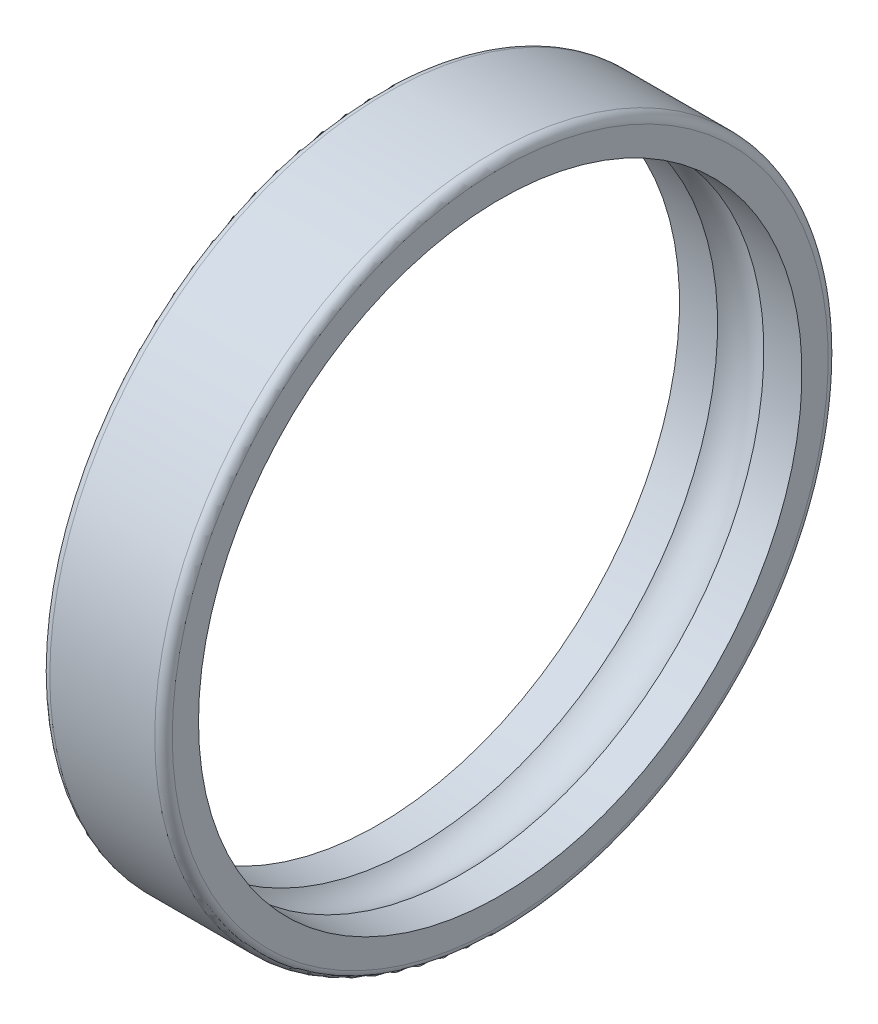
ISO-10303-21;
HEADER;
FILE_DESCRIPTION(('STEP AP214'),'2;1');
FILE_NAME('part.step','',(''),(''),'','','');
FILE_SCHEMA(('AUTOMOTIVE_DESIGN { 1 0 10303 214 1 1 1 1 }'));
ENDSEC;
DATA;
#1=APPLICATION_CONTEXT('core data for automotive mechanical design processes');
#2=APPLICATION_PROTOCOL_DEFINITION('international standard','automotive_design',2000,#1);
#3=PRODUCT_CONTEXT('',#1,'mechanical');
#4=PRODUCT('Part','Part','',(#3));
#5=PRODUCT_RELATED_PRODUCT_CATEGORY('part','',(#4));
#6=PRODUCT_DEFINITION_FORMATION('','',#4);
#7=PRODUCT_DEFINITION_CONTEXT('part definition',#1,'design');
#8=PRODUCT_DEFINITION('design','',#6,#7);
#9=PRODUCT_DEFINITION_SHAPE('','',#8);
#10=(LENGTH_UNIT() NAMED_UNIT(*) SI_UNIT(.MILLI.,.METRE.));
#11=(NAMED_UNIT(*) PLANE_ANGLE_UNIT() SI_UNIT($,.RADIAN.));
#12=(NAMED_UNIT(*) SI_UNIT($,.STERADIAN.) SOLID_ANGLE_UNIT());
#13=UNCERTAINTY_MEASURE_WITH_UNIT(LENGTH_MEASURE(1.E-05),#10,'distance_accuracy_value','');
#14=(GEOMETRIC_REPRESENTATION_CONTEXT(3) GLOBAL_UNCERTAINTY_ASSIGNED_CONTEXT((#13)) GLOBAL_UNIT_ASSIGNED_CONTEXT((#10,
#11,#12)) REPRESENTATION_CONTEXT('',''));
#15=CARTESIAN_POINT('',(0.,0.,0.));
#16=DIRECTION('',(0.,0.,1.));
#17=DIRECTION('',(1.,0.,0.));
#18=AXIS2_PLACEMENT_3D('',#15,#16,#17);
#19=CARTESIAN_POINT('',(0.,0.,0.));
#20=DIRECTION('',(-1.,0.,0.));
#21=DIRECTION('',(0.,0.,1.));
#22=AXIS2_PLACEMENT_3D('',#19,#20,#21);
#23=CYLINDRICAL_SURFACE('',#22,24.6428571428571);
#24=CARTESIAN_POINT('',(5.,0.,0.));
#25=DIRECTION('',(-1.,0.,0.));
#26=DIRECTION('',(0.,0.,1.));
#27=AXIS2_PLACEMENT_3D('',#24,#25,#26);
#28=CIRCLE('',#27,24.6428571428571);
#29=CARTESIAN_POINT('',(5.,0.,24.6428571428571));
#30=VERTEX_POINT('',#29);
#31=EDGE_CURVE('E376',#30,#30,#28,.T.);
#32=ORIENTED_EDGE('',*,*,#31,.F.);
#33=EDGE_LOOP('',(#32));
#34=FACE_BOUND('',#33,.T.);
#35=CARTESIAN_POINT('',(1.88982236504613,0.,0.));
#36=DIRECTION('',(-1.,0.,0.));
#37=DIRECTION('',(0.,0.,1.));
#38=AXIS2_PLACEMENT_3D('',#35,#36,#37);
#39=CIRCLE('',#38,24.6428571428571);
#40=CARTESIAN_POINT('',(1.88982236504613,0.,24.6428571428571));
#41=VERTEX_POINT('',#40);
#42=EDGE_CURVE('E10',#41,#41,#39,.T.);
#43=ORIENTED_EDGE('',*,*,#42,.T.);
#44=EDGE_LOOP('',(#43));
#45=FACE_BOUND('',#44,.T.);
#46=ADVANCED_FACE('F348',(#34,#45),#23,.F.);
#47=CARTESIAN_POINT('',(0.,0.,0.));
#48=DIRECTION('',(-1.,0.,0.));
#49=DIRECTION('',(0.,0.,1.));
#50=AXIS2_PLACEMENT_3D('',#47,#48,#49);
#51=TOROIDAL_SURFACE('',#50,22.5,2.85714285714286);
#52=ORIENTED_EDGE('',*,*,#42,.F.);
#53=EDGE_LOOP('',(#52));
#54=FACE_BOUND('',#53,.T.);
#55=CARTESIAN_POINT('',(-1.88982236504613,0.,0.));
#56=DIRECTION('',(-1.,0.,0.));
#57=DIRECTION('',(0.,0.,1.));
#58=AXIS2_PLACEMENT_3D('',#55,#56,#57);
#59=CIRCLE('',#58,24.6428571428571);
#60=CARTESIAN_POINT('',(-1.88982236504613,0.,24.6428571428571));
#61=VERTEX_POINT('',#60);
#62=EDGE_CURVE('E354',#61,#61,#59,.T.);
#63=ORIENTED_EDGE('',*,*,#62,.T.);
#64=EDGE_LOOP('',(#63));
#65=FACE_BOUND('',#64,.T.);
#66=ADVANCED_FACE('F383',(#54,#65),#51,.F.);
#67=CARTESIAN_POINT('',(0.,0.,0.));
#68=DIRECTION('',(-1.,0.,0.));
#69=DIRECTION('',(0.,0.,1.));
#70=AXIS2_PLACEMENT_3D('',#67,#68,#69);
#71=CYLINDRICAL_SURFACE('',#70,24.6428571428571);
#72=ORIENTED_EDGE('',*,*,#62,.F.);
#73=EDGE_LOOP('',(#72));
#74=FACE_BOUND('',#73,.T.);
#75=CARTESIAN_POINT('',(-5.,0.,0.));
#76=DIRECTION('',(-1.,0.,0.));
#77=DIRECTION('',(0.,0.,1.));
#78=AXIS2_PLACEMENT_3D('',#75,#76,#77);
#79=CIRCLE('',#78,24.6428571428571);
#80=CARTESIAN_POINT('',(-5.,0.,24.6428571428571));
#81=VERTEX_POINT('',#80);
#82=EDGE_CURVE('E358',#81,#81,#79,.T.);
#83=ORIENTED_EDGE('',*,*,#82,.T.);
#84=EDGE_LOOP('',(#83));
#85=FACE_BOUND('',#84,.T.);
#86=ADVANCED_FACE('F387',(#74,#85),#71,.F.);
#87=CARTESIAN_POINT('',(-5.,26.7857142857143,0.));
#88=DIRECTION('',(1.,0.,0.));
#89=DIRECTION('',(0.,0.,-1.));
#90=AXIS2_PLACEMENT_3D('',#87,#88,#89);
#91=PLANE('',#90);
#92=ORIENTED_EDGE('',*,*,#82,.F.);
#93=EDGE_LOOP('',(#92));
#94=FACE_BOUND('',#93,.T.);
#95=CARTESIAN_POINT('',(-5.,0.,0.));
#96=DIRECTION('',(-1.,0.,0.));
#97=DIRECTION('',(0.,0.,1.));
#98=AXIS2_PLACEMENT_3D('',#95,#96,#97);
#99=CIRCLE('',#98,26.7857142857143);
#100=CARTESIAN_POINT('',(-5.,0.,26.7857142857143));
#101=VERTEX_POINT('',#100);
#102=EDGE_CURVE('E362',#101,#101,#99,.T.);
#103=ORIENTED_EDGE('',*,*,#102,.T.);
#104=EDGE_LOOP('',(#103));
#105=FACE_BOUND('',#104,.T.);
#106=ADVANCED_FACE('F392',(#94,#105),#91,.F.);
#107=CARTESIAN_POINT('',(-4.28571428571429,0.,0.));
#108=DIRECTION('',(-1.,0.,0.));
#109=DIRECTION('',(0.,0.,1.));
#110=AXIS2_PLACEMENT_3D('',#107,#108,#109);
#111=TOROIDAL_SURFACE('',#110,26.7857142857143,0.714285714285715);
#112=ORIENTED_EDGE('',*,*,#102,.F.);
#113=EDGE_LOOP('',(#112));
#114=FACE_BOUND('',#113,.T.);
#115=CARTESIAN_POINT('',(-4.28571428571429,0.,0.));
#116=DIRECTION('',(-1.,0.,0.));
#117=DIRECTION('',(0.,0.,1.));
#118=AXIS2_PLACEMENT_3D('',#115,#116,#117);
#119=CIRCLE('',#118,27.5);
#120=CARTESIAN_POINT('',(-4.28571428571429,0.,27.5));
#121=VERTEX_POINT('',#120);
#122=EDGE_CURVE('E367',#121,#121,#119,.T.);
#123=ORIENTED_EDGE('',*,*,#122,.T.);
#124=EDGE_LOOP('',(#123));
#125=FACE_BOUND('',#124,.T.);
#126=ADVANCED_FACE('F398',(#114,#125),#111,.T.);
#127=CARTESIAN_POINT('',(0.,0.,0.));
#128=DIRECTION('',(-1.,0.,0.));
#129=DIRECTION('',(0.,0.,1.));
#130=AXIS2_PLACEMENT_3D('',#127,#128,#129);
#131=CYLINDRICAL_SURFACE('',#130,27.5);
#132=ORIENTED_EDGE('',*,*,#122,.F.);
#133=EDGE_LOOP('',(#132));
#134=FACE_BOUND('',#133,.T.);
#135=CARTESIAN_POINT('',(4.28571428571428,0.,0.));
#136=DIRECTION('',(-1.,0.,0.));
#137=DIRECTION('',(0.,0.,1.));
#138=AXIS2_PLACEMENT_3D('',#135,#136,#137);
#139=CIRCLE('',#138,27.5);
#140=CARTESIAN_POINT('',(4.28571428571428,0.,27.5));
#141=VERTEX_POINT('',#140);
#142=EDGE_CURVE('E370',#141,#141,#139,.T.);
#143=ORIENTED_EDGE('',*,*,#142,.T.);
#144=EDGE_LOOP('',(#143));
#145=FACE_BOUND('',#144,.T.);
#146=ADVANCED_FACE('F402',(#134,#145),#131,.T.);
#147=CARTESIAN_POINT('',(4.28571428571428,0.,0.));
#148=DIRECTION('',(-1.,0.,0.));
#149=DIRECTION('',(0.,0.,1.));
#150=AXIS2_PLACEMENT_3D('',#147,#148,#149);
#151=TOROIDAL_SURFACE('',#150,26.7857142857143,0.714285714285716);
#152=ORIENTED_EDGE('',*,*,#142,.F.);
#153=EDGE_LOOP('',(#152));
#154=FACE_BOUND('',#153,.T.);
#155=CARTESIAN_POINT('',(5.,0.,0.));
#156=DIRECTION('',(-1.,0.,0.));
#157=DIRECTION('',(0.,0.,1.));
#158=AXIS2_PLACEMENT_3D('',#155,#156,#157);
#159=CIRCLE('',#158,26.7857142857143);
#160=CARTESIAN_POINT('',(5.,0.,26.7857142857143));
#161=VERTEX_POINT('',#160);
#162=EDGE_CURVE('E373',#161,#161,#159,.T.);
#163=ORIENTED_EDGE('',*,*,#162,.T.);
#164=EDGE_LOOP('',(#163));
#165=FACE_BOUND('',#164,.T.);
#166=ADVANCED_FACE('F406',(#154,#165),#151,.T.);
#167=CARTESIAN_POINT('',(5.,26.7857142857143,0.));
#168=DIRECTION('',(-1.,0.,0.));
#169=DIRECTION('',(0.,0.,1.));
#170=AXIS2_PLACEMENT_3D('',#167,#168,#169);
#171=PLANE('',#170);
#172=ORIENTED_EDGE('',*,*,#162,.F.);
#173=EDGE_LOOP('',(#172));
#174=FACE_BOUND('',#173,.T.);
#175=ORIENTED_EDGE('',*,*,#31,.T.);
#176=EDGE_LOOP('',(#175));
#177=FACE_BOUND('',#176,.T.);
#178=ADVANCED_FACE('F380',(#174,#177),#171,.F.);
#179=CLOSED_SHELL('',(#46,#66,#86,#106,#126,#146,#166,#178));
#180=MANIFOLD_SOLID_BREP('B2',#179);
#181=ADVANCED_BREP_SHAPE_REPRESENTATION('',(#18,#180),#14);
#182=SHAPE_DEFINITION_REPRESENTATION(#9,#181);
ENDSEC;
END-ISO-10303-21;
